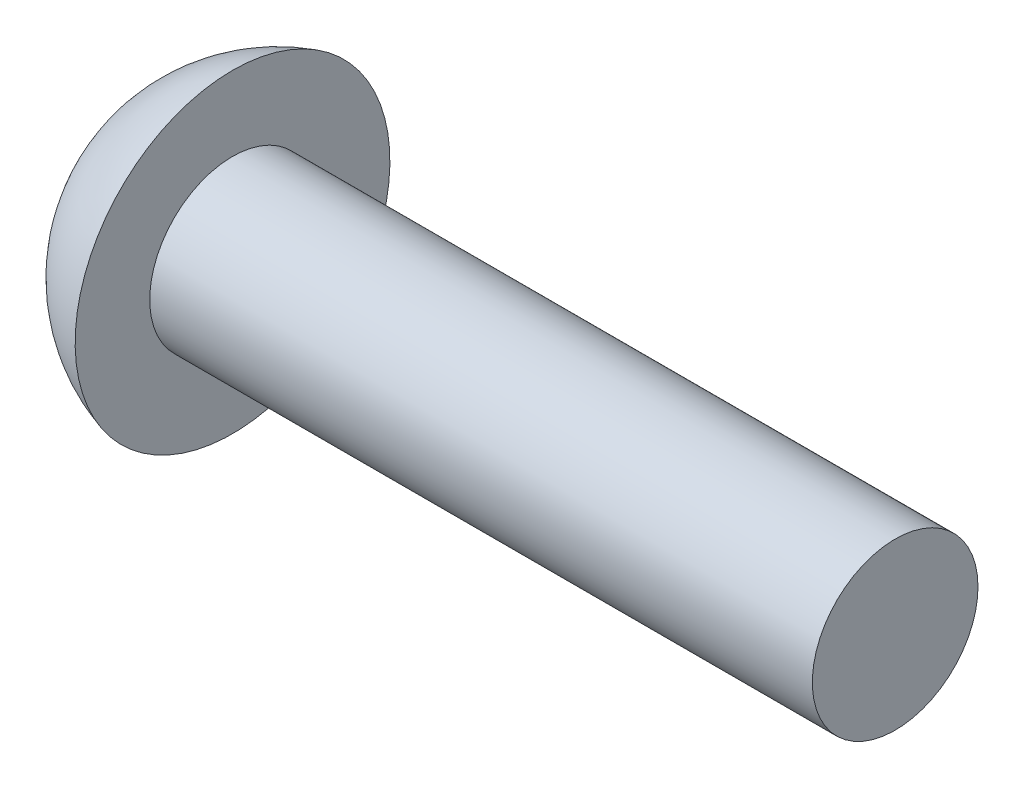
ISO-10303-21;
HEADER;
FILE_DESCRIPTION(('STEP AP214'),'2;1');
FILE_NAME('part.step','',(''),(''),'','','');
FILE_SCHEMA(('AUTOMOTIVE_DESIGN { 1 0 10303 214 1 1 1 1 }'));
ENDSEC;
DATA;
#1=APPLICATION_CONTEXT('core data for automotive mechanical design processes');
#2=APPLICATION_PROTOCOL_DEFINITION('international standard','automotive_design',2000,#1);
#3=PRODUCT_CONTEXT('',#1,'mechanical');
#4=PRODUCT('Part','Part','',(#3));
#5=PRODUCT_RELATED_PRODUCT_CATEGORY('part','',(#4));
#6=PRODUCT_DEFINITION_FORMATION('','',#4);
#7=PRODUCT_DEFINITION_CONTEXT('part definition',#1,'design');
#8=PRODUCT_DEFINITION('design','',#6,#7);
#9=PRODUCT_DEFINITION_SHAPE('','',#8);
#10=(LENGTH_UNIT() NAMED_UNIT(*) SI_UNIT(.MILLI.,.METRE.));
#11=(NAMED_UNIT(*) PLANE_ANGLE_UNIT() SI_UNIT($,.RADIAN.));
#12=(NAMED_UNIT(*) SI_UNIT($,.STERADIAN.) SOLID_ANGLE_UNIT());
#13=UNCERTAINTY_MEASURE_WITH_UNIT(LENGTH_MEASURE(1.E-05),#10,'distance_accuracy_value','');
#14=(GEOMETRIC_REPRESENTATION_CONTEXT(3) GLOBAL_UNCERTAINTY_ASSIGNED_CONTEXT((#13)) GLOBAL_UNIT_ASSIGNED_CONTEXT((#10,
#11,#12)) REPRESENTATION_CONTEXT('',''));
#15=CARTESIAN_POINT('',(0.,0.,0.));
#16=DIRECTION('',(0.,0.,1.));
#17=DIRECTION('',(1.,0.,0.));
#18=AXIS2_PLACEMENT_3D('',#15,#16,#17);
#19=CARTESIAN_POINT('',(0.,0.,0.));
#20=DIRECTION('',(1.,0.,0.));
#21=DIRECTION('',(0.,0.,-1.));
#22=AXIS2_PLACEMENT_3D('',#19,#20,#21);
#23=PLANE('',#22);
#24=CARTESIAN_POINT('',(0.,0.,0.));
#25=DIRECTION('',(-1.,0.,0.));
#26=DIRECTION('',(0.,0.,1.));
#27=AXIS2_PLACEMENT_3D('',#24,#25,#26);
#28=CIRCLE('',#27,1.65);
#29=CARTESIAN_POINT('',(0.,1.65,0.));
#30=VERTEX_POINT('',#29);
#31=EDGE_CURVE('E125',#30,#30,#28,.T.);
#32=ORIENTED_EDGE('',*,*,#31,.T.);
#33=EDGE_LOOP('',(#32));
#34=FACE_BOUND('',#33,.T.);
#35=DIRECTION('',(0.,0.866025403784439,-0.5));
#36=VECTOR('',#35,1.);
#37=CARTESIAN_POINT('',(0.,-0.999999999999999,-0.577350269189628));
#38=LINE('',#37,#36);
#39=CARTESIAN_POINT('',(0.,-0.999999999999999,-0.577350269189628));
#40=VERTEX_POINT('',#39);
#41=CARTESIAN_POINT('',(0.,0.,-1.15470053837925));
#42=VERTEX_POINT('',#41);
#43=EDGE_CURVE('E51',#40,#42,#38,.T.);
#44=ORIENTED_EDGE('',*,*,#43,.T.);
#45=DIRECTION('',(0.,0.866025403784439,0.5));
#46=VECTOR('',#45,1.);
#47=CARTESIAN_POINT('',(0.,0.,-1.15470053837925));
#48=LINE('',#47,#46);
#49=CARTESIAN_POINT('',(0.,1.,-0.577350269189626));
#50=VERTEX_POINT('',#49);
#51=EDGE_CURVE('E110',#42,#50,#48,.T.);
#52=ORIENTED_EDGE('',*,*,#51,.T.);
#53=DIRECTION('',(0.,0.,1.));
#54=VECTOR('',#53,1.);
#55=CARTESIAN_POINT('',(0.,1.,-0.577350269189626));
#56=LINE('',#55,#54);
#57=CARTESIAN_POINT('',(0.,1.,0.577350269189625));
#58=VERTEX_POINT('',#57);
#59=EDGE_CURVE('E108',#50,#58,#56,.T.);
#60=ORIENTED_EDGE('',*,*,#59,.T.);
#61=DIRECTION('',(0.,-0.866025403784439,0.5));
#62=VECTOR('',#61,1.);
#63=CARTESIAN_POINT('',(0.,1.,0.577350269189625));
#64=LINE('',#63,#62);
#65=CARTESIAN_POINT('',(0.,0.,1.15470053837925));
#66=VERTEX_POINT('',#65);
#67=EDGE_CURVE('E87',#58,#66,#64,.T.);
#68=ORIENTED_EDGE('',*,*,#67,.T.);
#69=DIRECTION('',(0.,-0.866025403784439,-0.5));
#70=VECTOR('',#69,1.);
#71=CARTESIAN_POINT('',(0.,0.,1.15470053837925));
#72=LINE('',#71,#70);
#73=CARTESIAN_POINT('',(0.,-0.999999999999999,0.577350269189625));
#74=VERTEX_POINT('',#73);
#75=EDGE_CURVE('E98',#66,#74,#72,.T.);
#76=ORIENTED_EDGE('',*,*,#75,.T.);
#77=DIRECTION('',(0.,0.,-1.));
#78=VECTOR('',#77,1.);
#79=CARTESIAN_POINT('',(0.,-0.999999999999999,0.577350269189625));
#80=LINE('',#79,#78);
#81=EDGE_CURVE('E104',#74,#40,#80,.T.);
#82=ORIENTED_EDGE('',*,*,#81,.T.);
#83=EDGE_LOOP('',(#44,#52,#60,#68,#76,#82));
#84=FACE_BOUND('',#83,.T.);
#85=ADVANCED_FACE('F37',(#34,#84),#23,.F.);
#86=CARTESIAN_POINT('',(1.65,0.,0.));
#87=DIRECTION('',(1.,0.,0.));
#88=DIRECTION('',(0.,0.,-1.));
#89=AXIS2_PLACEMENT_3D('',#86,#87,#88);
#90=PLANE('',#89);
#91=CARTESIAN_POINT('',(1.65,0.,0.));
#92=DIRECTION('',(-1.,0.,0.));
#93=DIRECTION('',(0.,0.,1.));
#94=AXIS2_PLACEMENT_3D('',#91,#92,#93);
#95=CIRCLE('',#94,2.85);
#96=CARTESIAN_POINT('',(1.65,2.85,0.));
#97=VERTEX_POINT('',#96);
#98=EDGE_CURVE('E128',#97,#97,#95,.T.);
#99=ORIENTED_EDGE('',*,*,#98,.F.);
#100=EDGE_LOOP('',(#99));
#101=FACE_BOUND('',#100,.T.);
#102=CARTESIAN_POINT('',(1.65,0.,0.));
#103=DIRECTION('',(1.,0.,0.));
#104=DIRECTION('',(0.,0.,-1.));
#105=AXIS2_PLACEMENT_3D('',#102,#103,#104);
#106=CIRCLE('',#105,1.5);
#107=CARTESIAN_POINT('',(1.65,0.,-1.5));
#108=VERTEX_POINT('',#107);
#109=EDGE_CURVE('E40',#108,#108,#106,.T.);
#110=ORIENTED_EDGE('',*,*,#109,.F.);
#111=EDGE_LOOP('',(#110));
#112=FACE_BOUND('',#111,.T.);
#113=ADVANCED_FACE('F140',(#101,#112),#90,.T.);
#114=CARTESIAN_POINT('',(13.65,0.,0.));
#115=DIRECTION('',(-1.,0.,0.));
#116=DIRECTION('',(0.,0.,1.));
#117=AXIS2_PLACEMENT_3D('',#114,#115,#116);
#118=CYLINDRICAL_SURFACE('',#117,1.5);
#119=CARTESIAN_POINT('',(13.65,0.,0.));
#120=DIRECTION('',(1.,0.,0.));
#121=DIRECTION('',(0.,0.,-1.));
#122=AXIS2_PLACEMENT_3D('',#119,#120,#121);
#123=CIRCLE('',#122,1.5);
#124=CARTESIAN_POINT('',(13.65,0.,-1.5));
#125=VERTEX_POINT('',#124);
#126=EDGE_CURVE('E11',#125,#125,#123,.T.);
#127=ORIENTED_EDGE('',*,*,#126,.F.);
#128=EDGE_LOOP('',(#127));
#129=FACE_BOUND('',#128,.T.);
#130=ORIENTED_EDGE('',*,*,#109,.T.);
#131=EDGE_LOOP('',(#130));
#132=FACE_BOUND('',#131,.T.);
#133=ADVANCED_FACE('F138',(#129,#132),#118,.T.);
#134=CARTESIAN_POINT('',(13.65,0.,0.));
#135=DIRECTION('',(1.,0.,0.));
#136=DIRECTION('',(0.,0.,-1.));
#137=AXIS2_PLACEMENT_3D('',#134,#135,#136);
#138=PLANE('',#137);
#139=ORIENTED_EDGE('',*,*,#126,.T.);
#140=EDGE_LOOP('',(#139));
#141=FACE_BOUND('',#140,.T.);
#142=ADVANCED_FACE('F146',(#141),#138,.T.);
#143=CARTESIAN_POINT('',(2.46136363636364,0.,0.));
#144=DIRECTION('',(-1.,0.,0.));
#145=DIRECTION('',(0.,1.,0.));
#146=AXIS2_PLACEMENT_3D('',#143,#144,#145);
#147=SPHERICAL_SURFACE('',#146,2.96324331610032);
#148=CARTESIAN_POINT('',(1.65,2.85,0.));
#149=CARTESIAN_POINT('',(1.6291329532092,2.84405942433189,0.));
#150=CARTESIAN_POINT('',(1.60833117382293,2.83788959578563,0.));
#151=CARTESIAN_POINT('',(1.56686813231484,2.82509458286439,0.));
#152=CARTESIAN_POINT('',(1.54620687019302,2.81846939848941,0.));
#153=CARTESIAN_POINT('',(1.50503484566925,2.80476682383831,0.));
#154=CARTESIAN_POINT('',(1.48452408326729,2.79768943356219,0.));
#155=CARTESIAN_POINT('',(1.44366294986413,2.78308587407077,0.));
#156=CARTESIAN_POINT('',(1.42331257886293,2.77555970485548,0.));
#157=CARTESIAN_POINT('',(1.38278204742793,2.7600622151904,0.));
#158=CARTESIAN_POINT('',(1.36260188699412,2.75209089474062,0.));
#159=CARTESIAN_POINT('',(1.32242151243736,2.73570694930301,0.));
#160=CARTESIAN_POINT('',(1.30242129831441,2.72729432431518,0.));
#161=CARTESIAN_POINT('',(1.26261046565632,2.71003182827508,0.));
#162=CARTESIAN_POINT('',(1.24279984712117,2.70118195722281,0.));
#163=CARTESIAN_POINT('',(1.20337776335067,2.68304923878237,0.));
#164=CARTESIAN_POINT('',(1.1837662981153,2.67376639139422,0.));
#165=CARTESIAN_POINT('',(1.1447519825989,2.65477219882087,0.));
#166=CARTESIAN_POINT('',(1.12534913231787,2.64506085363569,0.));
#167=CARTESIAN_POINT('',(1.08676140771064,2.62521435075984,0.));
#168=CARTESIAN_POINT('',(1.06757653338444,2.61507919306917,0.));
#169=CARTESIAN_POINT('',(1.02943401652561,2.59438995493852,0.));
#170=CARTESIAN_POINT('',(1.01047637399298,2.58383587449854,0.));
#171=CARTESIAN_POINT('',(0.972797466930397,2.56231388273834,0.));
#172=CARTESIAN_POINT('',(0.95407620240045,2.55134597141814,0.));
#173=CARTESIAN_POINT('',(0.916879083510753,2.52900160942095,0.));
#174=CARTESIAN_POINT('',(0.898403229151003,2.51762515874398,0.));
#175=CARTESIAN_POINT('',(0.861705844369813,2.49446920665867,0.));
#176=CARTESIAN_POINT('',(0.843484313948373,2.48268970525034,0.));
#177=CARTESIAN_POINT('',(0.807304368112072,2.45873333478155,0.));
#178=CARTESIAN_POINT('',(0.789345952697212,2.44655646572109,0.));
#179=CARTESIAN_POINT('',(0.75370090100119,2.42181123473927,0.));
#180=CARTESIAN_POINT('',(0.736014264720029,2.40924287281792,0.));
#181=CARTESIAN_POINT('',(0.700921304297327,2.38372071978322,0.));
#182=CARTESIAN_POINT('',(0.683514980155786,2.37076692866989,0.));
#183=CARTESIAN_POINT('',(0.648991041780254,2.34448016687239,0.));
#184=CARTESIAN_POINT('',(0.631873427546264,2.33114719618824,0.));
#185=CARTESIAN_POINT('',(0.597935167464229,2.30410850780733,0.));
#186=CARTESIAN_POINT('',(0.581114521616186,2.29040279011058,0.));
#187=CARTESIAN_POINT('',(0.547778313510556,2.26262522009638,0.));
#188=CARTESIAN_POINT('',(0.53126275125297,2.24855336777893,0.));
#189=CARTESIAN_POINT('',(0.498544678343689,2.22005031755867,0.));
#190=CARTESIAN_POINT('',(0.482342167691996,2.20561911965587,0.));
#191=CARTESIAN_POINT('',(0.450258014976531,2.17640434066839,0.));
#192=CARTESIAN_POINT('',(0.43437637291276,2.16162075958372,0.));
#193=CARTESIAN_POINT('',(0.402941619550878,2.13170834664476,0.));
#194=CARTESIAN_POINT('',(0.387388508252768,2.11657951479048,0.));
#195=CARTESIAN_POINT('',(0.356618320097299,2.08598389929346,0.));
#196=CARTESIAN_POINT('',(0.34140124323994,2.07051711565072,0.));
#197=CARTESIAN_POINT('',(0.311310465524572,2.03925305860096,0.));
#198=CARTESIAN_POINT('',(0.296436764666563,2.02345578519394,0.));
#199=CARTESIAN_POINT('',(0.267039914826372,1.99153837009932,0.));
#200=CARTESIAN_POINT('',(0.25251676584419,1.97541822841172,0.));
#201=CARTESIAN_POINT('',(0.223828026576252,1.94286285396016,0.));
#202=CARTESIAN_POINT('',(0.209662436290495,1.9264276211962,0.));
#203=CARTESIAN_POINT('',(0.181695648470199,1.89324999399595,0.));
#204=CARTESIAN_POINT('',(0.167894450935661,1.87650759955966,0.));
#205=CARTESIAN_POINT('',(0.140663107839179,1.84272372592911,0.));
#206=CARTESIAN_POINT('',(0.127232962277235,1.82568224673485,0.));
#207=CARTESIAN_POINT('',(0.100750199712538,1.79130842734056,0.));
#208=CARTESIAN_POINT('',(0.0876975827097848,1.77397608714052,0.));
#209=CARTESIAN_POINT('',(0.0619761852154649,1.73902890032392,0.));
#210=CARTESIAN_POINT('',(0.0493074047238985,1.72141405370734,0.));
#211=CARTESIAN_POINT('',(0.0243597526152558,1.68591038036187,0.));
#212=CARTESIAN_POINT('',(0.0120808809981796,1.66802155363296,0.));
#213=CARTESIAN_POINT('',(0.,1.65,0.));
#214=B_SPLINE_CURVE_WITH_KNOTS('',3,(#148,#149,#150,#151,#152,#153,#154,#155,#156,#157,#158,
#159,#160,#161,#162,#163,#164,#165,#166,#167,#168,#169,#170,#171,#172,#173,#174,#175,#176,#177,
#178,#179,#180,#181,#182,#183,#184,#185,#186,#187,#188,#189,#190,#191,#192,#193,#194,#195,#196,
#197,#198,#199,#200,#201,#202,#203,#204,#205,#206,#207,#208,#209,#210,#211,#212,#213),
.UNSPECIFIED.,.F.,.F.,(4,2,2,2,2,2,2,2,2,2,2,2,2,2,2,2,2,2,2,2,2,2,2,2,2,2,2,2,2,2,2,2,4),(0.,
0.0650872188273316,0.130174437654663,0.195261656481995,0.260348875309327,0.325436094136658,
0.39052331296399,0.455610531791322,0.520697750618653,0.585784969445985,0.650872188273316,
0.715959407100648,0.78104662592798,0.846133844755311,0.911221063582643,0.976308282409975,
1.04139550123731,1.10648272006464,1.17156993889197,1.2366571577193,1.30174437654663,
1.36683159537396,1.4319188142013,1.49700603302863,1.56209325185596,1.62718047068329,
1.69226768951062,1.75735490833795,1.82244212716529,1.88752934599262,1.95261656481995,
2.01770378364728,2.08279100247461),.UNSPECIFIED.);
#215=EDGE_CURVE('BSEAM153',#97,#30,#214,.T.);
#216=ORIENTED_EDGE('',*,*,#98,.T.);
#217=ORIENTED_EDGE('',*,*,#31,.F.);
#218=ORIENTED_EDGE('',*,*,#215,.T.);
#219=ORIENTED_EDGE('',*,*,#215,.F.);
#220=EDGE_LOOP('',(#216,#218,#217,#219));
#221=FACE_BOUND('',#220,.T.);
#222=ADVANCED_FACE('F153',(#221),#147,.T.);
#223=CARTESIAN_POINT('',(1.04,-0.999999999999999,-0.577350269189628));
#224=DIRECTION('',(0.,0.5,0.866025403784439));
#225=DIRECTION('',(0.,-0.866025403784439,0.5));
#226=AXIS2_PLACEMENT_3D('',#223,#224,#225);
#227=PLANE('',#226);
#228=ORIENTED_EDGE('',*,*,#43,.F.);
#229=DIRECTION('',(-1.,0.,0.));
#230=VECTOR('',#229,1.);
#231=CARTESIAN_POINT('',(1.04,-0.999999999999999,-0.577350269189628));
#232=LINE('',#231,#230);
#233=CARTESIAN_POINT('',(1.04,-0.999999999999999,-0.577350269189628));
#234=VERTEX_POINT('',#233);
#235=EDGE_CURVE('E116',#234,#40,#232,.T.);
#236=ORIENTED_EDGE('',*,*,#235,.F.);
#237=DIRECTION('',(0.,0.866025403784439,-0.5));
#238=VECTOR('',#237,1.);
#239=CARTESIAN_POINT('',(1.04,-0.999999999999999,-0.577350269189628));
#240=LINE('',#239,#238);
#241=CARTESIAN_POINT('',(1.04,0.,-1.15470053837925));
#242=VERTEX_POINT('',#241);
#243=EDGE_CURVE('E115',#234,#242,#240,.T.);
#244=ORIENTED_EDGE('',*,*,#243,.T.);
#245=DIRECTION('',(-1.,0.,0.));
#246=VECTOR('',#245,1.);
#247=CARTESIAN_POINT('',(1.04,0.,-1.15470053837925));
#248=LINE('',#247,#246);
#249=EDGE_CURVE('E123',#242,#42,#248,.T.);
#250=ORIENTED_EDGE('',*,*,#249,.T.);
#251=EDGE_LOOP('',(#228,#236,#244,#250));
#252=FACE_BOUND('',#251,.T.);
#253=ADVANCED_FACE('F157',(#252),#227,.T.);
#254=CARTESIAN_POINT('',(1.04,0.,-1.15470053837925));
#255=DIRECTION('',(0.,-0.5,0.866025403784438));
#256=DIRECTION('',(0.,-0.866025403784439,-0.5));
#257=AXIS2_PLACEMENT_3D('',#254,#255,#256);
#258=PLANE('',#257);
#259=ORIENTED_EDGE('',*,*,#51,.F.);
#260=ORIENTED_EDGE('',*,*,#249,.F.);
#261=DIRECTION('',(0.,0.866025403784439,0.5));
#262=VECTOR('',#261,1.);
#263=CARTESIAN_POINT('',(1.04,0.,-1.15470053837925));
#264=LINE('',#263,#262);
#265=CARTESIAN_POINT('',(1.04,1.,-0.577350269189626));
#266=VERTEX_POINT('',#265);
#267=EDGE_CURVE('E228',#242,#266,#264,.T.);
#268=ORIENTED_EDGE('',*,*,#267,.T.);
#269=DIRECTION('',(-1.,0.,0.));
#270=VECTOR('',#269,1.);
#271=CARTESIAN_POINT('',(1.04,1.,-0.577350269189626));
#272=LINE('',#271,#270);
#273=EDGE_CURVE('E121',#266,#50,#272,.T.);
#274=ORIENTED_EDGE('',*,*,#273,.T.);
#275=EDGE_LOOP('',(#259,#260,#268,#274));
#276=FACE_BOUND('',#275,.T.);
#277=ADVANCED_FACE('F160',(#276),#258,.T.);
#278=CARTESIAN_POINT('',(1.04,1.,-0.577350269189626));
#279=DIRECTION('',(0.,-1.,0.));
#280=DIRECTION('',(0.,0.,-1.));
#281=AXIS2_PLACEMENT_3D('',#278,#279,#280);
#282=PLANE('',#281);
#283=ORIENTED_EDGE('',*,*,#59,.F.);
#284=ORIENTED_EDGE('',*,*,#273,.F.);
#285=DIRECTION('',(0.,0.,1.));
#286=VECTOR('',#285,1.);
#287=CARTESIAN_POINT('',(1.04,1.,-0.577350269189626));
#288=LINE('',#287,#286);
#289=CARTESIAN_POINT('',(1.04,1.,0.577350269189625));
#290=VERTEX_POINT('',#289);
#291=EDGE_CURVE('E60',#266,#290,#288,.T.);
#292=ORIENTED_EDGE('',*,*,#291,.T.);
#293=DIRECTION('',(-1.,0.,0.));
#294=VECTOR('',#293,1.);
#295=CARTESIAN_POINT('',(1.04,1.,0.577350269189625));
#296=LINE('',#295,#294);
#297=EDGE_CURVE('E94',#290,#58,#296,.T.);
#298=ORIENTED_EDGE('',*,*,#297,.T.);
#299=EDGE_LOOP('',(#283,#284,#292,#298));
#300=FACE_BOUND('',#299,.T.);
#301=ADVANCED_FACE('F163',(#300),#282,.T.);
#302=CARTESIAN_POINT('',(1.04,1.,0.577350269189625));
#303=DIRECTION('',(0.,-0.5,-0.866025403784439));
#304=DIRECTION('',(0.,0.866025403784439,-0.5));
#305=AXIS2_PLACEMENT_3D('',#302,#303,#304);
#306=PLANE('',#305);
#307=ORIENTED_EDGE('',*,*,#67,.F.);
#308=ORIENTED_EDGE('',*,*,#297,.F.);
#309=DIRECTION('',(0.,-0.866025403784439,0.5));
#310=VECTOR('',#309,1.);
#311=CARTESIAN_POINT('',(1.04,1.,0.577350269189625));
#312=LINE('',#311,#310);
#313=CARTESIAN_POINT('',(1.04,0.,1.15470053837925));
#314=VERTEX_POINT('',#313);
#315=EDGE_CURVE('E91',#290,#314,#312,.T.);
#316=ORIENTED_EDGE('',*,*,#315,.T.);
#317=DIRECTION('',(-1.,0.,0.));
#318=VECTOR('',#317,1.);
#319=CARTESIAN_POINT('',(1.04,0.,1.15470053837925));
#320=LINE('',#319,#318);
#321=EDGE_CURVE('E82',#314,#66,#320,.T.);
#322=ORIENTED_EDGE('',*,*,#321,.T.);
#323=EDGE_LOOP('',(#307,#308,#316,#322));
#324=FACE_BOUND('',#323,.T.);
#325=ADVANCED_FACE('F84',(#324),#306,.T.);
#326=CARTESIAN_POINT('',(1.04,0.,1.15470053837925));
#327=DIRECTION('',(0.,0.5,-0.866025403784439));
#328=DIRECTION('',(0.,0.866025403784439,0.5));
#329=AXIS2_PLACEMENT_3D('',#326,#327,#328);
#330=PLANE('',#329);
#331=ORIENTED_EDGE('',*,*,#75,.F.);
#332=ORIENTED_EDGE('',*,*,#321,.F.);
#333=DIRECTION('',(0.,-0.866025403784439,-0.5));
#334=VECTOR('',#333,1.);
#335=CARTESIAN_POINT('',(1.04,0.,1.15470053837925));
#336=LINE('',#335,#334);
#337=CARTESIAN_POINT('',(1.04,-0.999999999999999,0.577350269189625));
#338=VERTEX_POINT('',#337);
#339=EDGE_CURVE('E203',#314,#338,#336,.T.);
#340=ORIENTED_EDGE('',*,*,#339,.T.);
#341=DIRECTION('',(-1.,0.,0.));
#342=VECTOR('',#341,1.);
#343=CARTESIAN_POINT('',(1.04,-0.999999999999999,0.577350269189625));
#344=LINE('',#343,#342);
#345=EDGE_CURVE('E95',#338,#74,#344,.T.);
#346=ORIENTED_EDGE('',*,*,#345,.T.);
#347=EDGE_LOOP('',(#331,#332,#340,#346));
#348=FACE_BOUND('',#347,.T.);
#349=ADVANCED_FACE('F99',(#348),#330,.T.);
#350=CARTESIAN_POINT('',(1.04,-0.999999999999999,0.577350269189625));
#351=DIRECTION('',(0.,1.,0.));
#352=DIRECTION('',(0.,0.,1.));
#353=AXIS2_PLACEMENT_3D('',#350,#351,#352);
#354=PLANE('',#353);
#355=ORIENTED_EDGE('',*,*,#81,.F.);
#356=ORIENTED_EDGE('',*,*,#345,.F.);
#357=DIRECTION('',(0.,0.,-1.));
#358=VECTOR('',#357,1.);
#359=CARTESIAN_POINT('',(1.04,-0.999999999999999,0.577350269189625));
#360=LINE('',#359,#358);
#361=EDGE_CURVE('E118',#338,#234,#360,.T.);
#362=ORIENTED_EDGE('',*,*,#361,.T.);
#363=ORIENTED_EDGE('',*,*,#235,.T.);
#364=EDGE_LOOP('',(#355,#356,#362,#363));
#365=FACE_BOUND('',#364,.T.);
#366=ADVANCED_FACE('F172',(#365),#354,.T.);
#367=CARTESIAN_POINT('',(1.04,0.,1.15470053837925));
#368=DIRECTION('',(0.86602540378444,-0.249999999999999,0.433012701892218));
#369=DIRECTION('',(0.447213595499956,0.,-0.894427190999917));
#370=AXIS2_PLACEMENT_3D('',#367,#368,#369);
#371=PLANE('',#370);
#372=ORIENTED_EDGE('',*,*,#339,.F.);
#373=DIRECTION('',(-0.447213595499956,0.,0.894427190999917));
#374=VECTOR('',#373,1.);
#375=CARTESIAN_POINT('',(1.04,0.,1.15470053837925));
#376=LINE('',#375,#374);
#377=CARTESIAN_POINT('',(1.61735026918962,0.,0.));
#378=VERTEX_POINT('',#377);
#379=EDGE_CURVE('E205',#378,#314,#376,.T.);
#380=ORIENTED_EDGE('',*,*,#379,.F.);
#381=DIRECTION('',(-0.447213595499956,-0.774596669241484,0.447213595499958));
#382=VECTOR('',#381,1.);
#383=CARTESIAN_POINT('',(1.04,-0.999999999999999,0.577350269189625));
#384=LINE('',#383,#382);
#385=EDGE_CURVE('E208',#378,#338,#384,.T.);
#386=ORIENTED_EDGE('',*,*,#385,.T.);
#387=EDGE_LOOP('',(#372,#380,#386));
#388=FACE_BOUND('',#387,.T.);
#389=ADVANCED_FACE('F175',(#388),#371,.F.);
#390=CARTESIAN_POINT('',(1.04,-0.999999999999999,0.577350269189625));
#391=DIRECTION('',(0.86602540378444,-0.499999999999998,0.));
#392=DIRECTION('',(0.499999999999998,0.86602540378444,0.));
#393=AXIS2_PLACEMENT_3D('',#390,#391,#392);
#394=PLANE('',#393);
#395=ORIENTED_EDGE('',*,*,#361,.F.);
#396=ORIENTED_EDGE('',*,*,#385,.F.);
#397=DIRECTION('',(-0.447213595499956,-0.774596669241484,-0.447213595499958));
#398=VECTOR('',#397,1.);
#399=CARTESIAN_POINT('',(1.04,-0.999999999999999,-0.577350269189628));
#400=LINE('',#399,#398);
#401=EDGE_CURVE('E232',#378,#234,#400,.T.);
#402=ORIENTED_EDGE('',*,*,#401,.T.);
#403=EDGE_LOOP('',(#395,#396,#402));
#404=FACE_BOUND('',#403,.T.);
#405=ADVANCED_FACE('F177',(#404),#394,.F.);
#406=CARTESIAN_POINT('',(1.04,-0.999999999999999,-0.577350269189628));
#407=DIRECTION('',(0.86602540378444,-0.249999999999999,-0.433012701892218));
#408=DIRECTION('',(-0.447213595499956,0.,-0.894427190999917));
#409=AXIS2_PLACEMENT_3D('',#406,#407,#408);
#410=PLANE('',#409);
#411=ORIENTED_EDGE('',*,*,#243,.F.);
#412=ORIENTED_EDGE('',*,*,#401,.F.);
#413=DIRECTION('',(-0.447213595499956,0.,-0.894427190999917));
#414=VECTOR('',#413,1.);
#415=CARTESIAN_POINT('',(1.04,0.,-1.15470053837925));
#416=LINE('',#415,#414);
#417=EDGE_CURVE('E240',#378,#242,#416,.T.);
#418=ORIENTED_EDGE('',*,*,#417,.T.);
#419=EDGE_LOOP('',(#411,#412,#418));
#420=FACE_BOUND('',#419,.T.);
#421=ADVANCED_FACE('F180',(#420),#410,.F.);
#422=CARTESIAN_POINT('',(1.04,0.,-1.15470053837925));
#423=DIRECTION('',(0.86602540378444,0.249999999999999,-0.433012701892218));
#424=DIRECTION('',(-0.447213595499956,0.,-0.894427190999917));
#425=AXIS2_PLACEMENT_3D('',#422,#423,#424);
#426=PLANE('',#425);
#427=ORIENTED_EDGE('',*,*,#267,.F.);
#428=ORIENTED_EDGE('',*,*,#417,.F.);
#429=DIRECTION('',(-0.447213595499956,0.774596669241484,-0.447213595499958));
#430=VECTOR('',#429,1.);
#431=CARTESIAN_POINT('',(1.04,1.,-0.577350269189626));
#432=LINE('',#431,#430);
#433=EDGE_CURVE('E242',#378,#266,#432,.T.);
#434=ORIENTED_EDGE('',*,*,#433,.T.);
#435=EDGE_LOOP('',(#427,#428,#434));
#436=FACE_BOUND('',#435,.T.);
#437=ADVANCED_FACE('F184',(#436),#426,.F.);
#438=CARTESIAN_POINT('',(1.04,1.,-0.577350269189626));
#439=DIRECTION('',(0.86602540378444,0.499999999999998,0.));
#440=DIRECTION('',(-0.499999999999998,0.86602540378444,0.));
#441=AXIS2_PLACEMENT_3D('',#438,#439,#440);
#442=PLANE('',#441);
#443=ORIENTED_EDGE('',*,*,#291,.F.);
#444=ORIENTED_EDGE('',*,*,#433,.F.);
#445=DIRECTION('',(-0.447213595499956,0.774596669241484,0.447213595499958));
#446=VECTOR('',#445,1.);
#447=CARTESIAN_POINT('',(1.04,1.,0.577350269189625));
#448=LINE('',#447,#446);
#449=EDGE_CURVE('E236',#378,#290,#448,.T.);
#450=ORIENTED_EDGE('',*,*,#449,.T.);
#451=EDGE_LOOP('',(#443,#444,#450));
#452=FACE_BOUND('',#451,.T.);
#453=ADVANCED_FACE('F188',(#452),#442,.F.);
#454=CARTESIAN_POINT('',(1.04,1.,0.577350269189625));
#455=DIRECTION('',(0.86602540378444,0.249999999999999,0.433012701892218));
#456=DIRECTION('',(0.447213595499956,0.,-0.894427190999917));
#457=AXIS2_PLACEMENT_3D('',#454,#455,#456);
#458=PLANE('',#457);
#459=ORIENTED_EDGE('',*,*,#315,.F.);
#460=ORIENTED_EDGE('',*,*,#449,.F.);
#461=ORIENTED_EDGE('',*,*,#379,.T.);
#462=EDGE_LOOP('',(#459,#460,#461));
#463=FACE_BOUND('',#462,.T.);
#464=ADVANCED_FACE('F192',(#463),#458,.F.);
#465=CLOSED_SHELL('',(#85,#113,#133,#142,#222,#253,#277,#301,#325,#349,#366,#389,#405,#421,#437,
#453,#464));
#466=MANIFOLD_SOLID_BREP('B2',#465);
#467=ADVANCED_BREP_SHAPE_REPRESENTATION('',(#18,#466),#14);
#468=SHAPE_DEFINITION_REPRESENTATION(#9,#467);
ENDSEC;
END-ISO-10303-21;
